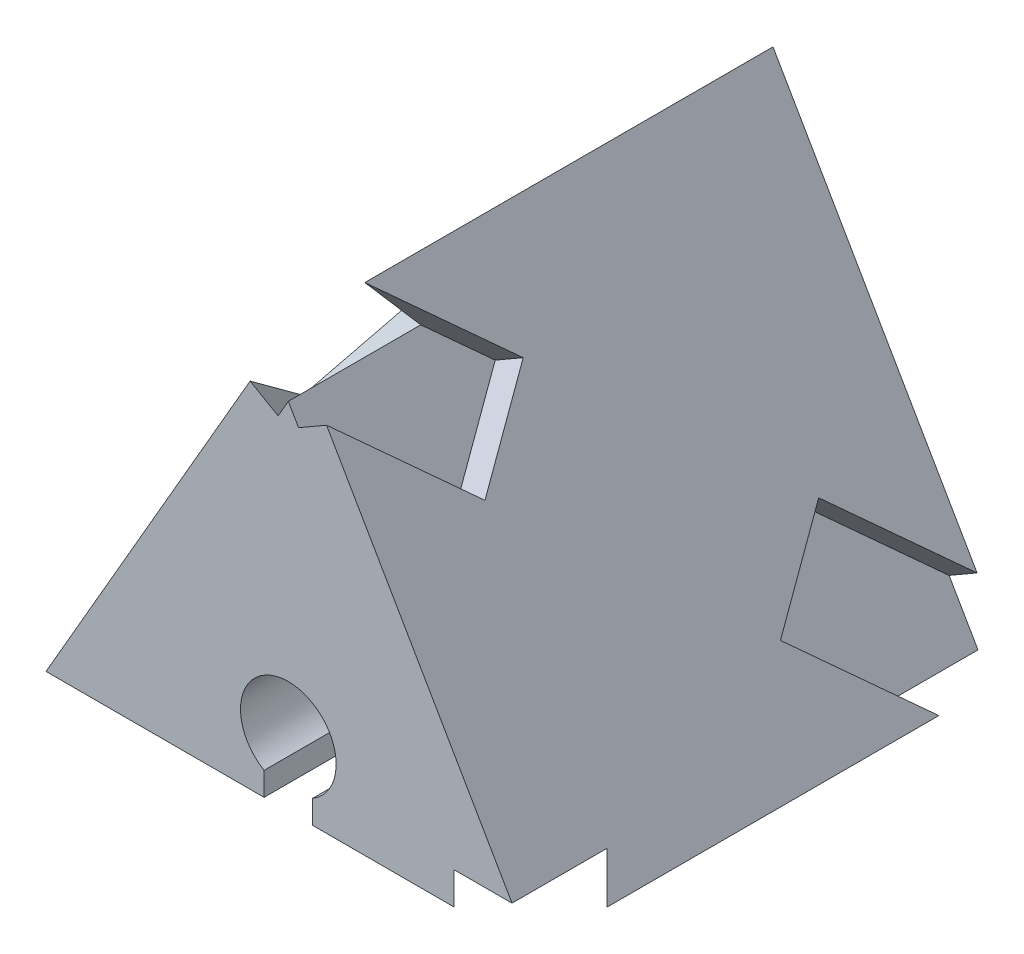
ISO-10303-21;
HEADER;
FILE_DESCRIPTION(('STEP AP214'),'2;1');
FILE_NAME('part.step','',(''),(''),'','','');
FILE_SCHEMA(('AUTOMOTIVE_DESIGN { 1 0 10303 214 1 1 1 1 }'));
ENDSEC;
DATA;
#1=APPLICATION_CONTEXT('core data for automotive mechanical design processes');
#2=APPLICATION_PROTOCOL_DEFINITION('international standard','automotive_design',2000,#1);
#3=PRODUCT_CONTEXT('',#1,'mechanical');
#4=PRODUCT('Part','Part','',(#3));
#5=PRODUCT_RELATED_PRODUCT_CATEGORY('part','',(#4));
#6=PRODUCT_DEFINITION_FORMATION('','',#4);
#7=PRODUCT_DEFINITION_CONTEXT('part definition',#1,'design');
#8=PRODUCT_DEFINITION('design','',#6,#7);
#9=PRODUCT_DEFINITION_SHAPE('','',#8);
#10=(LENGTH_UNIT() NAMED_UNIT(*) SI_UNIT(.MILLI.,.METRE.));
#11=(NAMED_UNIT(*) PLANE_ANGLE_UNIT() SI_UNIT($,.RADIAN.));
#12=(NAMED_UNIT(*) SI_UNIT($,.STERADIAN.) SOLID_ANGLE_UNIT());
#13=UNCERTAINTY_MEASURE_WITH_UNIT(LENGTH_MEASURE(1.E-05),#10,'distance_accuracy_value','');
#14=(GEOMETRIC_REPRESENTATION_CONTEXT(3) GLOBAL_UNCERTAINTY_ASSIGNED_CONTEXT((#13)) GLOBAL_UNIT_ASSIGNED_CONTEXT((#10,
#11,#12)) REPRESENTATION_CONTEXT('',''));
#15=CARTESIAN_POINT('',(0.,0.,0.));
#16=DIRECTION('',(0.,0.,1.));
#17=DIRECTION('',(1.,0.,0.));
#18=AXIS2_PLACEMENT_3D('',#15,#16,#17);
#19=CARTESIAN_POINT('',(38.1,0.,-38.1));
#20=DIRECTION('',(0.,0.,1.));
#21=DIRECTION('',(1.,0.,0.));
#22=AXIS2_PLACEMENT_3D('',#19,#20,#21);
#23=PLANE('',#22);
#24=DIRECTION('',(0.,-1.,0.));
#25=VECTOR('',#24,1.);
#26=CARTESIAN_POINT('',(6.00958739621938,0.,-38.1));
#27=LINE('',#26,#25);
#28=CARTESIAN_POINT('',(6.00958739621938,2.54,-38.1));
#29=VERTEX_POINT('',#28);
#30=CARTESIAN_POINT('',(6.00958739621938,0.,-38.1));
#31=VERTEX_POINT('',#30);
#32=EDGE_CURVE('E259',#29,#31,#27,.T.);
#33=ORIENTED_EDGE('',*,*,#32,.F.);
#34=DIRECTION('',(1.,0.,0.));
#35=VECTOR('',#34,1.);
#36=CARTESIAN_POINT('',(38.1,2.54000000000002,-38.1));
#37=LINE('',#36,#35);
#38=CARTESIAN_POINT('',(4.39940905122495,2.54,-38.1));
#39=VERTEX_POINT('',#38);
#40=EDGE_CURVE('E245',#39,#29,#37,.T.);
#41=ORIENTED_EDGE('',*,*,#40,.F.);
#42=DIRECTION('',(-0.5,-0.866025403784439,0.));
#43=VECTOR('',#42,1.);
#44=CARTESIAN_POINT('',(11.7247045256125,15.2277839420936,-38.1));
#45=LINE('',#44,#43);
#46=CARTESIAN_POINT('',(5.20449822372217,3.93445535138876,-38.1));
#47=VERTEX_POINT('',#46);
#48=EDGE_CURVE('E438',#47,#39,#45,.T.);
#49=ORIENTED_EDGE('',*,*,#48,.F.);
#50=DIRECTION('',(-0.866025403784439,0.5,0.));
#51=VECTOR('',#50,1.);
#52=CARTESIAN_POINT('',(31.5797936981097,-11.2933285907048,-38.1));
#53=LINE('',#52,#51);
#54=CARTESIAN_POINT('',(3.00479369810969,5.20445535138876,-38.1));
#55=VERTEX_POINT('',#54);
#56=EDGE_CURVE('E355',#47,#55,#53,.T.);
#57=ORIENTED_EDGE('',*,*,#56,.T.);
#58=DIRECTION('',(-0.5,-0.866025403784439,0.));
#59=VECTOR('',#58,1.);
#60=CARTESIAN_POINT('',(0.,0.,-38.1));
#61=LINE('',#60,#59);
#62=CARTESIAN_POINT('',(19.05,32.9955678841871,-38.1));
#63=VERTEX_POINT('',#62);
#64=EDGE_CURVE('E416',#63,#55,#61,.T.);
#65=ORIENTED_EDGE('',*,*,#64,.F.);
#66=DIRECTION('',(-0.5,0.866025403784439,0.));
#67=VECTOR('',#66,1.);
#68=CARTESIAN_POINT('',(38.1,0.,-38.1));
#69=LINE('',#68,#67);
#70=CARTESIAN_POINT('',(35.0952063018903,5.20445535138877,-38.1));
#71=VERTEX_POINT('',#70);
#72=EDGE_CURVE('E413',#71,#63,#69,.T.);
#73=ORIENTED_EDGE('',*,*,#72,.F.);
#74=DIRECTION('',(0.866025403784439,0.5,0.));
#75=VECTOR('',#74,1.);
#76=CARTESIAN_POINT('',(35.0952063018903,5.20445535138876,-38.1));
#77=LINE('',#76,#75);
#78=CARTESIAN_POINT('',(32.8955017762778,3.93445535138877,-38.1));
#79=VERTEX_POINT('',#78);
#80=EDGE_CURVE('E446',#79,#71,#77,.T.);
#81=ORIENTED_EDGE('',*,*,#80,.F.);
#82=DIRECTION('',(-0.5,0.866025403784439,0.));
#83=VECTOR('',#82,1.);
#84=CARTESIAN_POINT('',(35.9002954743875,-1.26999999999999,-38.1));
#85=LINE('',#84,#83);
#86=CARTESIAN_POINT('',(35.1670606325167,0.,-38.1));
#87=VERTEX_POINT('',#86);
#88=EDGE_CURVE('E444',#87,#79,#85,.T.);
#89=ORIENTED_EDGE('',*,*,#88,.F.);
#90=DIRECTION('',(1.,0.,0.));
#91=VECTOR('',#90,1.);
#92=CARTESIAN_POINT('',(0.,0.,-38.1));
#93=LINE('',#92,#91);
#94=CARTESIAN_POINT('',(20.955,0.,-38.1));
#95=VERTEX_POINT('',#94);
#96=EDGE_CURVE('E414',#95,#87,#93,.T.);
#97=ORIENTED_EDGE('',*,*,#96,.F.);
#98=DIRECTION('',(0.,1.,0.));
#99=VECTOR('',#98,1.);
#100=CARTESIAN_POINT('',(20.955,1.83923471383687,-38.1));
#101=LINE('',#100,#99);
#102=CARTESIAN_POINT('',(20.955,1.83923471383687,-38.1));
#103=VERTEX_POINT('',#102);
#104=EDGE_CURVE('E384',#95,#103,#101,.T.);
#105=ORIENTED_EDGE('',*,*,#104,.T.);
#106=CARTESIAN_POINT('',(19.05,5.08,-38.1));
#107=DIRECTION('',(0.,0.,1.));
#108=DIRECTION('',(1.,0.,0.));
#109=AXIS2_PLACEMENT_3D('',#106,#107,#108);
#110=CIRCLE('',#109,3.7592);
#111=CARTESIAN_POINT('',(17.145,1.83923471383687,-38.1));
#112=VERTEX_POINT('',#111);
#113=EDGE_CURVE('E396',#103,#112,#110,.T.);
#114=ORIENTED_EDGE('',*,*,#113,.T.);
#115=DIRECTION('',(0.,-1.,0.));
#116=VECTOR('',#115,1.);
#117=CARTESIAN_POINT('',(17.145,0.,-38.1));
#118=LINE('',#117,#116);
#119=CARTESIAN_POINT('',(17.145,0.,-38.1));
#120=VERTEX_POINT('',#119);
#121=EDGE_CURVE('E388',#112,#120,#118,.T.);
#122=ORIENTED_EDGE('',*,*,#121,.T.);
#123=EDGE_CURVE('E411',#31,#120,#93,.T.);
#124=ORIENTED_EDGE('',*,*,#123,.F.);
#125=EDGE_LOOP('',(#33,#41,#49,#57,#65,#73,#81,#89,#97,#105,#114,#122,#124));
#126=FACE_BOUND('',#125,.T.);
#127=ADVANCED_FACE('F34',(#126),#23,.F.);
#128=CARTESIAN_POINT('',(0.,0.,-38.1));
#129=DIRECTION('',(0.,-1.,0.));
#130=DIRECTION('',(1.,0.,0.));
#131=AXIS2_PLACEMENT_3D('',#128,#129,#130);
#132=PLANE('',#131);
#133=DIRECTION('',(0.,0.,1.));
#134=VECTOR('',#133,1.);
#135=CARTESIAN_POINT('',(0.,0.,-38.1));
#136=LINE('',#135,#134);
#137=CARTESIAN_POINT('',(0.,0.,-32.0904126037805));
#138=VERTEX_POINT('',#137);
#139=CARTESIAN_POINT('',(0.,0.,0.));
#140=VERTEX_POINT('',#139);
#141=EDGE_CURVE('E428',#138,#140,#136,.T.);
#142=ORIENTED_EDGE('',*,*,#141,.F.);
#143=DIRECTION('',(0.707106781186551,0.,0.707106781186544));
#144=VECTOR('',#143,1.);
#145=CARTESIAN_POINT('',(-8.783482259868,0.,-40.8738948636484));
#146=LINE('',#145,#144);
#147=CARTESIAN_POINT('',(8.30238704789757,0.,-23.788025555883));
#148=VERTEX_POINT('',#147);
#149=EDGE_CURVE('E250',#138,#148,#146,.T.);
#150=ORIENTED_EDGE('',*,*,#149,.T.);
#151=DIRECTION('',(0.707106781186548,0.,-0.707106781186547));
#152=VECTOR('',#151,1.);
#153=CARTESIAN_POINT('',(8.30238704789757,0.,-23.788025555883));
#154=LINE('',#153,#152);
#155=CARTESIAN_POINT('',(14.311974444117,0.,-29.7976129521025));
#156=VERTEX_POINT('',#155);
#157=EDGE_CURVE('E247',#148,#156,#154,.T.);
#158=ORIENTED_EDGE('',*,*,#157,.T.);
#159=DIRECTION('',(-0.707106781186551,0.,-0.707106781186544));
#160=VECTOR('',#159,1.);
#161=CARTESIAN_POINT('',(14.311974444117,0.,-29.7976129521025));
#162=LINE('',#161,#160);
#163=EDGE_CURVE('E240',#156,#31,#162,.T.);
#164=ORIENTED_EDGE('',*,*,#163,.T.);
#165=ORIENTED_EDGE('',*,*,#123,.T.);
#166=DIRECTION('',(0.,0.,-1.));
#167=VECTOR('',#166,1.);
#168=CARTESIAN_POINT('',(17.145,0.,0.));
#169=LINE('',#168,#167);
#170=CARTESIAN_POINT('',(17.145,0.,0.));
#171=VERTEX_POINT('',#170);
#172=EDGE_CURVE('E393',#171,#120,#169,.T.);
#173=ORIENTED_EDGE('',*,*,#172,.F.);
#174=DIRECTION('',(1.,0.,0.));
#175=VECTOR('',#174,1.);
#176=CARTESIAN_POINT('',(0.,0.,0.));
#177=LINE('',#176,#175);
#178=EDGE_CURVE('E420',#140,#171,#177,.T.);
#179=ORIENTED_EDGE('',*,*,#178,.F.);
#180=EDGE_LOOP('',(#142,#150,#158,#164,#165,#173,#179));
#181=FACE_BOUND('',#180,.T.);
#182=ADVANCED_FACE('F484',(#181),#132,.T.);
#183=CARTESIAN_POINT('',(-2.19203660432153,-8.87671877073564,-40.8738948636484));
#184=DIRECTION('',(-0.353553390593272,-0.612372435695791,0.707106781186551));
#185=DIRECTION('',(0.,-0.755928946018458,-0.654653670707973));
#186=AXIS2_PLACEMENT_3D('',#183,#184,#185);
#187=PLANE('',#186);
#188=DIRECTION('',(0.65465367070798,0.377964473009229,0.654653670707973));
#189=VECTOR('',#188,1.);
#190=CARTESIAN_POINT('',(-6.900212072569,-3.98383929756321,-38.9906246763494));
#191=LINE('',#190,#189);
#192=CARTESIAN_POINT('',(4.39940905122495,2.54,-27.6910035525556));
#193=VERTEX_POINT('',#192);
#194=EDGE_CURVE('E257',#138,#193,#191,.T.);
#195=ORIENTED_EDGE('',*,*,#194,.F.);
#196=DIRECTION('',(0.353553390593276,0.612372435695798,0.707106781186544));
#197=VECTOR('',#196,1.);
#198=CARTESIAN_POINT('',(-1.50239684905489,-2.60222767569447,-35.0952063018902));
#199=LINE('',#198,#197);
#200=CARTESIAN_POINT('',(4.15119352394878,7.19007809553018,-23.788025555883));
#201=VERTEX_POINT('',#200);
#202=EDGE_CURVE('E430',#138,#201,#199,.T.);
#203=ORIENTED_EDGE('',*,*,#202,.T.);
#204=DIRECTION('',(-0.866025403784439,0.5,0.));
#205=VECTOR('',#204,1.);
#206=CARTESIAN_POINT('',(6.35089804956126,5.92007809553018,-23.788025555883));
#207=LINE('',#206,#205);
#208=CARTESIAN_POINT('',(6.35089804956126,5.92007809553018,-23.788025555883));
#209=VERTEX_POINT('',#208);
#210=EDGE_CURVE('E349',#209,#201,#207,.T.);
#211=ORIENTED_EDGE('',*,*,#210,.F.);
#212=DIRECTION('',(0.353553390593276,0.612372435695797,0.707106781186544));
#213=VECTOR('',#212,1.);
#214=CARTESIAN_POINT('',(-2.19203660432153,-8.87671877073564,-40.8738948636484));
#215=LINE('',#214,#213);
#216=EDGE_CURVE('E340',#193,#209,#215,.T.);
#217=ORIENTED_EDGE('',*,*,#216,.F.);
#218=EDGE_LOOP('',(#195,#203,#211,#217));
#219=FACE_BOUND('',#218,.T.);
#220=ADVANCED_FACE('F490',(#219),#187,.F.);
#221=CARTESIAN_POINT('',(6.35089804956126,5.92007809553018,-23.788025555883));
#222=DIRECTION('',(-0.866025403784439,0.5,0.));
#223=DIRECTION('',(-0.5,-0.866025403784439,0.));
#224=AXIS2_PLACEMENT_3D('',#221,#222,#223);
#225=PLANE('',#224);
#226=ORIENTED_EDGE('',*,*,#48,.T.);
#227=DIRECTION('',(0.,0.,1.));
#228=VECTOR('',#227,1.);
#229=CARTESIAN_POINT('',(4.39940905122495,2.54,-23.788025555883));
#230=LINE('',#229,#228);
#231=EDGE_CURVE('E11',#39,#193,#230,.T.);
#232=ORIENTED_EDGE('',*,*,#231,.T.);
#233=ORIENTED_EDGE('',*,*,#216,.T.);
#234=DIRECTION('',(0.353553390593274,0.612372435695795,-0.707106781186547));
#235=VECTOR('',#234,1.);
#236=CARTESIAN_POINT('',(6.35089804956126,5.92007809553018,-23.788025555883));
#237=LINE('',#236,#235);
#238=CARTESIAN_POINT('',(9.355691747671,11.124533446919,-29.7976129521025));
#239=VERTEX_POINT('',#238);
#240=EDGE_CURVE('E342',#209,#239,#237,.T.);
#241=ORIENTED_EDGE('',*,*,#240,.T.);
#242=DIRECTION('',(-0.353553390593276,-0.612372435695798,-0.707106781186544));
#243=VECTOR('',#242,1.);
#244=CARTESIAN_POINT('',(9.355691747671,11.124533446919,-29.7976129521025));
#245=LINE('',#244,#243);
#246=EDGE_CURVE('E346',#239,#47,#245,.T.);
#247=ORIENTED_EDGE('',*,*,#246,.T.);
#248=EDGE_LOOP('',(#226,#232,#233,#241,#247));
#249=FACE_BOUND('',#248,.T.);
#250=ADVANCED_FACE('F504',(#249),#225,.T.);
#251=CARTESIAN_POINT('',(38.1,0.,-38.1));
#252=DIRECTION('',(0.866025403784439,0.5,0.));
#253=DIRECTION('',(-0.5,0.866025403784439,0.));
#254=AXIS2_PLACEMENT_3D('',#251,#252,#253);
#255=PLANE('',#254);
#256=DIRECTION('',(0.,0.,1.));
#257=VECTOR('',#256,1.);
#258=CARTESIAN_POINT('',(36.6335303162583,2.54000000000002,-38.1));
#259=LINE('',#258,#257);
#260=CARTESIAN_POINT('',(36.6335303162584,2.54000000000002,-7.47605707996119));
#261=VERTEX_POINT('',#260);
#262=CARTESIAN_POINT('',(36.6335303162583,2.54000000000002,0.));
#263=VERTEX_POINT('',#262);
#264=EDGE_CURVE('E57',#261,#263,#259,.T.);
#265=ORIENTED_EDGE('',*,*,#264,.F.);
#266=DIRECTION('',(0.447213595499958,-0.774596669241484,0.447213595499957));
#267=VECTOR('',#266,1.);
#268=CARTESIAN_POINT('',(31.6819174792439,11.1164450131193,-12.4276699169756));
#269=LINE('',#268,#267);
#270=CARTESIAN_POINT('',(38.1,0.,-6.00958739621953));
#271=VERTEX_POINT('',#270);
#272=EDGE_CURVE('E283',#261,#271,#269,.T.);
#273=ORIENTED_EDGE('',*,*,#272,.T.);
#274=DIRECTION('',(0.,0.,1.));
#275=VECTOR('',#274,1.);
#276=CARTESIAN_POINT('',(38.1,0.,-38.1));
#277=LINE('',#276,#275);
#278=CARTESIAN_POINT('',(38.1,0.,-32.0904126037805));
#279=VERTEX_POINT('',#278);
#280=EDGE_CURVE('E419',#279,#271,#277,.T.);
#281=ORIENTED_EDGE('',*,*,#280,.F.);
#282=DIRECTION('',(-0.353553390593276,0.612372435695797,0.707106781186544));
#283=VECTOR('',#282,1.);
#284=CARTESIAN_POINT('',(42.491741129934,-7.60671877073564,-40.8738948636484));
#285=LINE('',#284,#283);
#286=CARTESIAN_POINT('',(33.9488064760512,7.19007809553019,-23.788025555883));
#287=VERTEX_POINT('',#286);
#288=EDGE_CURVE('E286',#279,#287,#285,.T.);
#289=ORIENTED_EDGE('',*,*,#288,.T.);
#290=DIRECTION('',(-0.353553390593274,0.612372435695795,-0.707106781186547));
#291=VECTOR('',#290,1.);
#292=CARTESIAN_POINT('',(33.9488064760512,7.19007809553019,-23.788025555883));
#293=LINE('',#292,#291);
#294=CARTESIAN_POINT('',(30.9440127779415,12.394533446919,-29.7976129521025));
#295=VERTEX_POINT('',#294);
#296=EDGE_CURVE('E290',#287,#295,#293,.T.);
#297=ORIENTED_EDGE('',*,*,#296,.T.);
#298=DIRECTION('',(0.353553390593276,-0.612372435695798,-0.707106781186544));
#299=VECTOR('',#298,1.);
#300=CARTESIAN_POINT('',(30.9440127779415,12.394533446919,-29.7976129521025));
#301=LINE('',#300,#299);
#302=EDGE_CURVE('E298',#295,#71,#301,.T.);
#303=ORIENTED_EDGE('',*,*,#302,.T.);
#304=ORIENTED_EDGE('',*,*,#72,.T.);
#305=DIRECTION('',(0.,0.,1.));
#306=VECTOR('',#305,1.);
#307=CARTESIAN_POINT('',(19.05,32.9955678841871,-38.1));
#308=LINE('',#307,#306);
#309=CARTESIAN_POINT('',(19.05,32.9955678841871,-6.00958739621954));
#310=VERTEX_POINT('',#309);
#311=EDGE_CURVE('E431',#63,#310,#308,.T.);
#312=ORIENTED_EDGE('',*,*,#311,.T.);
#313=DIRECTION('',(0.353553390593274,-0.612372435695795,-0.707106781186547));
#314=VECTOR('',#313,1.);
#315=CARTESIAN_POINT('',(23.2011935239488,25.8054897886569,-14.3119744441171));
#316=LINE('',#315,#314);
#317=CARTESIAN_POINT('',(23.2011935239488,25.8054897886569,-14.3119744441171));
#318=VERTEX_POINT('',#317);
#319=EDGE_CURVE('E310',#310,#318,#316,.T.);
#320=ORIENTED_EDGE('',*,*,#319,.T.);
#321=DIRECTION('',(0.353553390593273,-0.612372435695793,0.707106781186549));
#322=VECTOR('',#321,1.);
#323=CARTESIAN_POINT('',(26.2059872220585,20.6010344372681,-8.3023870478976));
#324=LINE('',#323,#322);
#325=CARTESIAN_POINT('',(26.2059872220585,20.6010344372681,-8.3023870478976));
#326=VERTEX_POINT('',#325);
#327=EDGE_CURVE('E314',#318,#326,#324,.T.);
#328=ORIENTED_EDGE('',*,*,#327,.T.);
#329=DIRECTION('',(-0.353553390593275,0.612372435695797,0.707106781186544));
#330=VECTOR('',#329,1.);
#331=CARTESIAN_POINT('',(17.6630525681757,35.397831303534,8.78348225986793));
#332=LINE('',#331,#330);
#333=CARTESIAN_POINT('',(22.0547936981097,27.7911125327984,0.));
#334=VERTEX_POINT('',#333);
#335=EDGE_CURVE('E322',#326,#334,#332,.T.);
#336=ORIENTED_EDGE('',*,*,#335,.T.);
#337=DIRECTION('',(-0.5,0.866025403784439,0.));
#338=VECTOR('',#337,1.);
#339=CARTESIAN_POINT('',(38.1,0.,0.));
#340=LINE('',#339,#338);
#341=EDGE_CURVE('E423',#263,#334,#340,.T.);
#342=ORIENTED_EDGE('',*,*,#341,.F.);
#343=EDGE_LOOP('',(#265,#273,#281,#289,#297,#303,#304,#312,#320,#328,#336,#342));
#344=FACE_BOUND('',#343,.T.);
#345=ADVANCED_FACE('F502',(#344),#255,.T.);
#346=ORIENTED_EDGE('',*,*,#280,.T.);
#347=DIRECTION('',(-0.707106781186548,0.,-0.707106781186547));
#348=VECTOR('',#347,1.);
#349=CARTESIAN_POINT('',(29.7976129521024,0.,-14.3119744441171));
#350=LINE('',#349,#348);
#351=CARTESIAN_POINT('',(29.7976129521024,0.,-14.3119744441171));
#352=VERTEX_POINT('',#351);
#353=EDGE_CURVE('E261',#271,#352,#350,.T.);
#354=ORIENTED_EDGE('',*,*,#353,.T.);
#355=DIRECTION('',(-0.707106781186546,0.,0.707106781186549));
#356=VECTOR('',#355,1.);
#357=CARTESIAN_POINT('',(23.788025555883,0.,-8.3023870478976));
#358=LINE('',#357,#356);
#359=CARTESIAN_POINT('',(23.788025555883,0.,-8.3023870478976));
#360=VERTEX_POINT('',#359);
#361=EDGE_CURVE('E265',#352,#360,#358,.T.);
#362=ORIENTED_EDGE('',*,*,#361,.T.);
#363=DIRECTION('',(0.707106781186551,0.,0.707106781186544));
#364=VECTOR('',#363,1.);
#365=CARTESIAN_POINT('',(40.8738948636487,0.,8.78348225986793));
#366=LINE('',#365,#364);
#367=CARTESIAN_POINT('',(32.0904126037806,0.,0.));
#368=VERTEX_POINT('',#367);
#369=EDGE_CURVE('E273',#360,#368,#366,.T.);
#370=ORIENTED_EDGE('',*,*,#369,.T.);
#371=CARTESIAN_POINT('',(20.955,0.,0.));
#372=VERTEX_POINT('',#371);
#373=EDGE_CURVE('E410',#372,#368,#177,.T.);
#374=ORIENTED_EDGE('',*,*,#373,.F.);
#375=DIRECTION('',(0.,0.,-1.));
#376=VECTOR('',#375,1.);
#377=CARTESIAN_POINT('',(20.955,0.,0.));
#378=LINE('',#377,#376);
#379=EDGE_CURVE('E407',#372,#95,#378,.T.);
#380=ORIENTED_EDGE('',*,*,#379,.T.);
#381=ORIENTED_EDGE('',*,*,#96,.T.);
#382=DIRECTION('',(0.,0.,1.));
#383=VECTOR('',#382,1.);
#384=CARTESIAN_POINT('',(35.1670606325167,0.,-38.1));
#385=LINE('',#384,#383);
#386=CARTESIAN_POINT('',(35.1670606325167,0.,-30.6239429200388));
#387=VERTEX_POINT('',#386);
#388=EDGE_CURVE('E306',#87,#387,#385,.T.);
#389=ORIENTED_EDGE('',*,*,#388,.T.);
#390=DIRECTION('',(0.894427190999918,0.,-0.447213595499954));
#391=VECTOR('',#390,1.);
#392=CARTESIAN_POINT('',(10.0238349584877,0.,-18.0523300830245));
#393=LINE('',#392,#391);
#394=EDGE_CURVE('E448',#387,#279,#393,.T.);
#395=ORIENTED_EDGE('',*,*,#394,.T.);
#396=EDGE_LOOP('',(#346,#354,#362,#370,#374,#380,#381,#389,#395));
#397=FACE_BOUND('',#396,.T.);
#398=ADVANCED_FACE('F36',(#397),#132,.T.);
#399=CARTESIAN_POINT('',(38.1,0.,0.));
#400=DIRECTION('',(0.,0.,1.));
#401=DIRECTION('',(1.,0.,0.));
#402=AXIS2_PLACEMENT_3D('',#399,#400,#401);
#403=PLANE('',#402);
#404=ORIENTED_EDGE('',*,*,#373,.T.);
#405=DIRECTION('',(0.,1.,0.));
#406=VECTOR('',#405,1.);
#407=CARTESIAN_POINT('',(32.0904126037806,0.,0.));
#408=LINE('',#407,#406);
#409=CARTESIAN_POINT('',(32.0904126037806,2.54000000000001,0.));
#410=VERTEX_POINT('',#409);
#411=EDGE_CURVE('E42',#368,#410,#408,.T.);
#412=ORIENTED_EDGE('',*,*,#411,.T.);
#413=DIRECTION('',(-1.,0.,0.));
#414=VECTOR('',#413,1.);
#415=CARTESIAN_POINT('',(38.1,2.54000000000002,0.));
#416=LINE('',#415,#414);
#417=EDGE_CURVE('E451',#263,#410,#416,.T.);
#418=ORIENTED_EDGE('',*,*,#417,.F.);
#419=ORIENTED_EDGE('',*,*,#341,.T.);
#420=DIRECTION('',(-0.866025403784439,-0.5,0.));
#421=VECTOR('',#420,1.);
#422=CARTESIAN_POINT('',(22.0547936981097,27.7911125327984,0.));
#423=LINE('',#422,#421);
#424=CARTESIAN_POINT('',(19.8550891724972,26.5211125327984,0.));
#425=VERTEX_POINT('',#424);
#426=EDGE_CURVE('E336',#334,#425,#423,.T.);
#427=ORIENTED_EDGE('',*,*,#426,.T.);
#428=DIRECTION('',(0.5,-0.866025403784439,0.));
#429=VECTOR('',#428,1.);
#430=CARTESIAN_POINT('',(35.9002954743875,-1.26999999999999,0.));
#431=LINE('',#430,#429);
#432=CARTESIAN_POINT('',(19.05,27.9155678841871,0.));
#433=VERTEX_POINT('',#432);
#434=EDGE_CURVE('E330',#433,#425,#431,.T.);
#435=ORIENTED_EDGE('',*,*,#434,.F.);
#436=DIRECTION('',(0.5,0.866025403784439,0.));
#437=VECTOR('',#436,1.);
#438=CARTESIAN_POINT('',(11.7247045256125,15.2277839420936,0.));
#439=LINE('',#438,#437);
#440=CARTESIAN_POINT('',(18.2449108275028,26.5211125327984,0.));
#441=VERTEX_POINT('',#440);
#442=EDGE_CURVE('E377',#441,#433,#439,.T.);
#443=ORIENTED_EDGE('',*,*,#442,.F.);
#444=DIRECTION('',(0.866025403784439,-0.5,0.));
#445=VECTOR('',#444,1.);
#446=CARTESIAN_POINT('',(44.6202063018903,11.2933285907048,0.));
#447=LINE('',#446,#445);
#448=CARTESIAN_POINT('',(16.0452063018903,27.7911125327984,0.));
#449=VERTEX_POINT('',#448);
#450=EDGE_CURVE('E382',#449,#441,#447,.T.);
#451=ORIENTED_EDGE('',*,*,#450,.F.);
#452=DIRECTION('',(-0.5,-0.866025403784439,0.));
#453=VECTOR('',#452,1.);
#454=CARTESIAN_POINT('',(0.,0.,0.));
#455=LINE('',#454,#453);
#456=EDGE_CURVE('E425',#449,#140,#455,.T.);
#457=ORIENTED_EDGE('',*,*,#456,.T.);
#458=ORIENTED_EDGE('',*,*,#178,.T.);
#459=DIRECTION('',(0.,-1.,0.));
#460=VECTOR('',#459,1.);
#461=CARTESIAN_POINT('',(17.145,0.,0.));
#462=LINE('',#461,#460);
#463=CARTESIAN_POINT('',(17.145,1.83923471383687,0.));
#464=VERTEX_POINT('',#463);
#465=EDGE_CURVE('E391',#464,#171,#462,.T.);
#466=ORIENTED_EDGE('',*,*,#465,.F.);
#467=CARTESIAN_POINT('',(19.05,5.08,0.));
#468=DIRECTION('',(0.,0.,1.));
#469=DIRECTION('',(1.,0.,0.));
#470=AXIS2_PLACEMENT_3D('',#467,#468,#469);
#471=CIRCLE('',#470,3.7592);
#472=CARTESIAN_POINT('',(20.955,1.83923471383687,0.));
#473=VERTEX_POINT('',#472);
#474=EDGE_CURVE('E387',#473,#464,#471,.T.);
#475=ORIENTED_EDGE('',*,*,#474,.F.);
#476=DIRECTION('',(0.,1.,0.));
#477=VECTOR('',#476,1.);
#478=CARTESIAN_POINT('',(20.955,1.83923471383687,0.));
#479=LINE('',#478,#477);
#480=EDGE_CURVE('E385',#372,#473,#479,.T.);
#481=ORIENTED_EDGE('',*,*,#480,.F.);
#482=EDGE_LOOP('',(#404,#412,#418,#419,#427,#435,#443,#451,#457,#458,#466,#475,#481));
#483=FACE_BOUND('',#482,.T.);
#484=ADVANCED_FACE('F455',(#483),#403,.T.);
#485=CARTESIAN_POINT('',(17.0985110016637,24.5354897886569,-14.3119744441171));
#486=DIRECTION('',(0.353553390593274,0.612372435695794,-0.707106781186548));
#487=DIRECTION('',(0.,0.755928946018455,0.654653670707977));
#488=AXIS2_PLACEMENT_3D('',#485,#486,#487);
#489=PLANE('',#488);
#490=DIRECTION('',(0.,-0.755928946018455,-0.654653670707977));
#491=VECTOR('',#490,1.);
#492=CARTESIAN_POINT('',(19.05,24.0526214892955,-13.7544061588781));
#493=LINE('',#492,#491);
#494=CARTESIAN_POINT('',(19.05,27.9155678841871,-10.4089964474445));
#495=VERTEX_POINT('',#494);
#496=EDGE_CURVE('E333',#310,#495,#493,.T.);
#497=ORIENTED_EDGE('',*,*,#496,.F.);
#498=DIRECTION('',(-0.353553390593274,-0.612372435695795,-0.707106781186547));
#499=VECTOR('',#498,1.);
#500=CARTESIAN_POINT('',(14.8988064760512,25.8054897886569,-14.3119744441171));
#501=LINE('',#500,#499);
#502=CARTESIAN_POINT('',(14.8988064760512,25.8054897886569,-14.3119744441171));
#503=VERTEX_POINT('',#502);
#504=EDGE_CURVE('E359',#310,#503,#501,.T.);
#505=ORIENTED_EDGE('',*,*,#504,.T.);
#506=DIRECTION('',(-0.866025403784439,0.5,0.));
#507=VECTOR('',#506,1.);
#508=CARTESIAN_POINT('',(17.0985110016637,24.5354897886569,-14.3119744441171));
#509=LINE('',#508,#507);
#510=CARTESIAN_POINT('',(17.0985110016637,24.5354897886569,-14.3119744441171));
#511=VERTEX_POINT('',#510);
#512=EDGE_CURVE('E369',#511,#503,#509,.T.);
#513=ORIENTED_EDGE('',*,*,#512,.F.);
#514=DIRECTION('',(-0.353553390593274,-0.612372435695795,-0.707106781186547));
#515=VECTOR('',#514,1.);
#516=CARTESIAN_POINT('',(17.0985110016637,24.5354897886569,-14.3119744441171));
#517=LINE('',#516,#515);
#518=EDGE_CURVE('E360',#495,#511,#517,.T.);
#519=ORIENTED_EDGE('',*,*,#518,.F.);
#520=EDGE_LOOP('',(#497,#505,#513,#519));
#521=FACE_BOUND('',#520,.T.);
#522=ADVANCED_FACE('F498',(#521),#489,.F.);
#523=CARTESIAN_POINT('',(0.,0.,-38.1));
#524=DIRECTION('',(-0.866025403784439,0.5,0.));
#525=DIRECTION('',(-0.5,-0.866025403784439,0.));
#526=AXIS2_PLACEMENT_3D('',#523,#524,#525);
#527=PLANE('',#526);
#528=ORIENTED_EDGE('',*,*,#202,.F.);
#529=ORIENTED_EDGE('',*,*,#141,.T.);
#530=ORIENTED_EDGE('',*,*,#456,.F.);
#531=DIRECTION('',(0.353553390593275,0.612372435695797,0.707106781186544));
#532=VECTOR('',#531,1.);
#533=CARTESIAN_POINT('',(20.4369474318243,35.397831303534,8.78348225986793));
#534=LINE('',#533,#532);
#535=CARTESIAN_POINT('',(11.8940127779415,20.6010344372681,-8.3023870478976));
#536=VERTEX_POINT('',#535);
#537=EDGE_CURVE('E363',#536,#449,#534,.T.);
#538=ORIENTED_EDGE('',*,*,#537,.F.);
#539=DIRECTION('',(-0.353553390593273,-0.612372435695793,0.707106781186549));
#540=VECTOR('',#539,1.);
#541=CARTESIAN_POINT('',(11.8940127779415,20.6010344372681,-8.3023870478976));
#542=LINE('',#541,#540);
#543=EDGE_CURVE('E371',#503,#536,#542,.T.);
#544=ORIENTED_EDGE('',*,*,#543,.F.);
#545=ORIENTED_EDGE('',*,*,#504,.F.);
#546=ORIENTED_EDGE('',*,*,#311,.F.);
#547=ORIENTED_EDGE('',*,*,#64,.T.);
#548=DIRECTION('',(-0.353553390593276,-0.612372435695798,-0.707106781186544));
#549=VECTOR('',#548,1.);
#550=CARTESIAN_POINT('',(7.15598722205853,12.394533446919,-29.7976129521025));
#551=LINE('',#550,#549);
#552=CARTESIAN_POINT('',(7.15598722205853,12.394533446919,-29.7976129521025));
#553=VERTEX_POINT('',#552);
#554=EDGE_CURVE('E343',#553,#55,#551,.T.);
#555=ORIENTED_EDGE('',*,*,#554,.F.);
#556=DIRECTION('',(0.353553390593274,0.612372435695795,-0.707106781186547));
#557=VECTOR('',#556,1.);
#558=CARTESIAN_POINT('',(4.15119352394879,7.19007809553019,-23.788025555883));
#559=LINE('',#558,#557);
#560=EDGE_CURVE('E339',#201,#553,#559,.T.);
#561=ORIENTED_EDGE('',*,*,#560,.F.);
#562=EDGE_LOOP('',(#528,#529,#530,#538,#544,#545,#546,#547,#555,#561));
#563=FACE_BOUND('',#562,.T.);
#564=ADVANCED_FACE('F499',(#563),#527,.T.);
#565=CARTESIAN_POINT('',(20.955,1.83923471383687,0.));
#566=DIRECTION('',(-1.,0.,0.));
#567=DIRECTION('',(0.,0.,1.));
#568=AXIS2_PLACEMENT_3D('',#565,#566,#567);
#569=PLANE('',#568);
#570=ORIENTED_EDGE('',*,*,#104,.F.);
#571=ORIENTED_EDGE('',*,*,#379,.F.);
#572=ORIENTED_EDGE('',*,*,#480,.T.);
#573=DIRECTION('',(0.,0.,-1.));
#574=VECTOR('',#573,1.);
#575=CARTESIAN_POINT('',(20.955,1.83923471383687,0.));
#576=LINE('',#575,#574);
#577=EDGE_CURVE('E405',#473,#103,#576,.T.);
#578=ORIENTED_EDGE('',*,*,#577,.T.);
#579=EDGE_LOOP('',(#570,#571,#572,#578));
#580=FACE_BOUND('',#579,.T.);
#581=ADVANCED_FACE('F494',(#580),#569,.T.);
#582=CARTESIAN_POINT('',(19.05,5.08,0.));
#583=DIRECTION('',(0.,0.,-1.));
#584=DIRECTION('',(-1.,0.,0.));
#585=AXIS2_PLACEMENT_3D('',#582,#583,#584);
#586=CYLINDRICAL_SURFACE('',#585,3.7592);
#587=ORIENTED_EDGE('',*,*,#113,.F.);
#588=ORIENTED_EDGE('',*,*,#577,.F.);
#589=ORIENTED_EDGE('',*,*,#474,.T.);
#590=DIRECTION('',(0.,0.,-1.));
#591=VECTOR('',#590,1.);
#592=CARTESIAN_POINT('',(17.145,1.83923471383687,0.));
#593=LINE('',#592,#591);
#594=EDGE_CURVE('E403',#464,#112,#593,.T.);
#595=ORIENTED_EDGE('',*,*,#594,.T.);
#596=EDGE_LOOP('',(#587,#588,#589,#595));
#597=FACE_BOUND('',#596,.T.);
#598=ADVANCED_FACE('F549',(#597),#586,.F.);
#599=CARTESIAN_POINT('',(17.145,0.,0.));
#600=DIRECTION('',(1.,0.,0.));
#601=DIRECTION('',(0.,0.,-1.));
#602=AXIS2_PLACEMENT_3D('',#599,#600,#601);
#603=PLANE('',#602);
#604=ORIENTED_EDGE('',*,*,#121,.F.);
#605=ORIENTED_EDGE('',*,*,#594,.F.);
#606=ORIENTED_EDGE('',*,*,#465,.T.);
#607=ORIENTED_EDGE('',*,*,#172,.T.);
#608=EDGE_LOOP('',(#604,#605,#606,#607));
#609=FACE_BOUND('',#608,.T.);
#610=ADVANCED_FACE('F545',(#609),#603,.T.);
#611=CARTESIAN_POINT('',(22.6366519574368,34.127831303534,8.78348225986793));
#612=DIRECTION('',(-0.353553390593272,-0.612372435695792,0.707106781186551));
#613=DIRECTION('',(0.,-0.755928946018458,-0.654653670707974));
#614=AXIS2_PLACEMENT_3D('',#611,#612,#613);
#615=PLANE('',#614);
#616=ORIENTED_EDGE('',*,*,#450,.T.);
#617=DIRECTION('',(0.353553390593275,0.612372435695797,0.707106781186544));
#618=VECTOR('',#617,1.);
#619=CARTESIAN_POINT('',(22.6366519574368,34.127831303534,8.78348225986793));
#620=LINE('',#619,#618);
#621=CARTESIAN_POINT('',(14.093717303554,19.3310344372681,-8.3023870478976));
#622=VERTEX_POINT('',#621);
#623=EDGE_CURVE('E366',#622,#441,#620,.T.);
#624=ORIENTED_EDGE('',*,*,#623,.F.);
#625=DIRECTION('',(-0.866025403784439,0.5,0.));
#626=VECTOR('',#625,1.);
#627=CARTESIAN_POINT('',(14.093717303554,19.3310344372681,-8.3023870478976));
#628=LINE('',#627,#626);
#629=EDGE_CURVE('E375',#622,#536,#628,.T.);
#630=ORIENTED_EDGE('',*,*,#629,.T.);
#631=ORIENTED_EDGE('',*,*,#537,.T.);
#632=EDGE_LOOP('',(#616,#624,#630,#631));
#633=FACE_BOUND('',#632,.T.);
#634=ADVANCED_FACE('F532',(#633),#615,.F.);
#635=CARTESIAN_POINT('',(14.093717303554,19.3310344372681,-8.3023870478976));
#636=DIRECTION('',(-0.353553390593275,-0.612372435695796,-0.707106781186546));
#637=DIRECTION('',(0.,0.755928946018453,-0.654653670707979));
#638=AXIS2_PLACEMENT_3D('',#635,#636,#637);
#639=PLANE('',#638);
#640=ORIENTED_EDGE('',*,*,#543,.T.);
#641=ORIENTED_EDGE('',*,*,#629,.F.);
#642=DIRECTION('',(-0.353553390593273,-0.612372435695793,0.707106781186549));
#643=VECTOR('',#642,1.);
#644=CARTESIAN_POINT('',(14.093717303554,19.3310344372681,-8.3023870478976));
#645=LINE('',#644,#643);
#646=EDGE_CURVE('E362',#511,#622,#645,.T.);
#647=ORIENTED_EDGE('',*,*,#646,.F.);
#648=ORIENTED_EDGE('',*,*,#512,.T.);
#649=EDGE_LOOP('',(#640,#641,#647,#648));
#650=FACE_BOUND('',#649,.T.);
#651=ADVANCED_FACE('F604',(#650),#639,.F.);
#652=CARTESIAN_POINT('',(25.6414456555465,39.3322866549228,2.7738948636485));
#653=DIRECTION('',(0.866025403784439,-0.5,0.));
#654=DIRECTION('',(0.5,0.866025403784439,0.));
#655=AXIS2_PLACEMENT_3D('',#652,#653,#654);
#656=PLANE('',#655);
#657=ORIENTED_EDGE('',*,*,#442,.T.);
#658=DIRECTION('',(0.,0.,-1.));
#659=VECTOR('',#658,1.);
#660=CARTESIAN_POINT('',(19.05,27.9155678841871,2.7738948636485));
#661=LINE('',#660,#659);
#662=EDGE_CURVE('E441',#433,#495,#661,.T.);
#663=ORIENTED_EDGE('',*,*,#662,.T.);
#664=ORIENTED_EDGE('',*,*,#518,.T.);
#665=ORIENTED_EDGE('',*,*,#646,.T.);
#666=ORIENTED_EDGE('',*,*,#623,.T.);
#667=EDGE_LOOP('',(#657,#663,#664,#665,#666));
#668=FACE_BOUND('',#667,.T.);
#669=ADVANCED_FACE('F527',(#668),#656,.F.);
#670=CARTESIAN_POINT('',(9.355691747671,11.124533446919,-29.7976129521025));
#671=DIRECTION('',(0.353553390593272,0.612372435695791,-0.707106781186551));
#672=DIRECTION('',(0.,0.755928946018458,0.654653670707974));
#673=AXIS2_PLACEMENT_3D('',#670,#671,#672);
#674=PLANE('',#673);
#675=ORIENTED_EDGE('',*,*,#246,.F.);
#676=DIRECTION('',(-0.866025403784439,0.5,0.));
#677=VECTOR('',#676,1.);
#678=CARTESIAN_POINT('',(9.355691747671,11.124533446919,-29.7976129521025));
#679=LINE('',#678,#677);
#680=EDGE_CURVE('E353',#239,#553,#679,.T.);
#681=ORIENTED_EDGE('',*,*,#680,.T.);
#682=ORIENTED_EDGE('',*,*,#554,.T.);
#683=ORIENTED_EDGE('',*,*,#56,.F.);
#684=EDGE_LOOP('',(#675,#681,#682,#683));
#685=FACE_BOUND('',#684,.T.);
#686=ADVANCED_FACE('F592',(#685),#674,.F.);
#687=CARTESIAN_POINT('',(6.35089804956126,5.92007809553018,-23.788025555883));
#688=DIRECTION('',(0.353553390593274,0.612372435695794,0.707106781186548));
#689=DIRECTION('',(0.,-0.755928946018455,0.654653670707977));
#690=AXIS2_PLACEMENT_3D('',#687,#688,#689);
#691=PLANE('',#690);
#692=ORIENTED_EDGE('',*,*,#560,.T.);
#693=ORIENTED_EDGE('',*,*,#680,.F.);
#694=ORIENTED_EDGE('',*,*,#240,.F.);
#695=ORIENTED_EDGE('',*,*,#210,.T.);
#696=EDGE_LOOP('',(#692,#693,#694,#695));
#697=FACE_BOUND('',#696,.T.);
#698=ADVANCED_FACE('F589',(#697),#691,.F.);
#699=CARTESIAN_POINT('',(21.0014889983363,24.5354897886569,-14.3119744441171));
#700=DIRECTION('',(0.353553390593274,-0.612372435695794,0.707106781186548));
#701=DIRECTION('',(0.,-0.755928946018455,-0.654653670707977));
#702=AXIS2_PLACEMENT_3D('',#699,#700,#701);
#703=PLANE('',#702);
#704=ORIENTED_EDGE('',*,*,#496,.T.);
#705=DIRECTION('',(0.353553390593274,-0.612372435695795,-0.707106781186547));
#706=VECTOR('',#705,1.);
#707=CARTESIAN_POINT('',(21.0014889983363,24.5354897886569,-14.3119744441171));
#708=LINE('',#707,#706);
#709=CARTESIAN_POINT('',(21.0014889983363,24.5354897886569,-14.3119744441171));
#710=VERTEX_POINT('',#709);
#711=EDGE_CURVE('E311',#495,#710,#708,.T.);
#712=ORIENTED_EDGE('',*,*,#711,.T.);
#713=DIRECTION('',(0.866025403784439,0.5,0.));
#714=VECTOR('',#713,1.);
#715=CARTESIAN_POINT('',(21.0014889983363,24.5354897886569,-14.3119744441171));
#716=LINE('',#715,#714);
#717=EDGE_CURVE('E327',#710,#318,#716,.T.);
#718=ORIENTED_EDGE('',*,*,#717,.T.);
#719=ORIENTED_EDGE('',*,*,#319,.F.);
#720=EDGE_LOOP('',(#704,#712,#718,#719));
#721=FACE_BOUND('',#720,.T.);
#722=ADVANCED_FACE('F584',(#721),#703,.T.);
#723=CARTESIAN_POINT('',(24.006282696446,19.3310344372681,-8.3023870478976));
#724=DIRECTION('',(-0.353553390593275,0.612372435695796,0.707106781186546));
#725=DIRECTION('',(0.,-0.755928946018453,0.654653670707979));
#726=AXIS2_PLACEMENT_3D('',#723,#724,#725);
#727=PLANE('',#726);
#728=ORIENTED_EDGE('',*,*,#327,.F.);
#729=ORIENTED_EDGE('',*,*,#717,.F.);
#730=DIRECTION('',(0.353553390593273,-0.612372435695793,0.707106781186549));
#731=VECTOR('',#730,1.);
#732=CARTESIAN_POINT('',(24.006282696446,19.3310344372681,-8.3023870478976));
#733=LINE('',#732,#731);
#734=CARTESIAN_POINT('',(24.006282696446,19.3310344372681,-8.3023870478976));
#735=VERTEX_POINT('',#734);
#736=EDGE_CURVE('E317',#710,#735,#733,.T.);
#737=ORIENTED_EDGE('',*,*,#736,.T.);
#738=DIRECTION('',(0.866025403784439,0.5,0.));
#739=VECTOR('',#738,1.);
#740=CARTESIAN_POINT('',(24.006282696446,19.3310344372681,-8.3023870478976));
#741=LINE('',#740,#739);
#742=EDGE_CURVE('E319',#735,#326,#741,.T.);
#743=ORIENTED_EDGE('',*,*,#742,.T.);
#744=EDGE_LOOP('',(#728,#729,#737,#743));
#745=FACE_BOUND('',#744,.T.);
#746=ADVANCED_FACE('F581',(#745),#727,.T.);
#747=CARTESIAN_POINT('',(15.4633480425632,34.127831303534,8.78348225986793));
#748=DIRECTION('',(-0.353553390593272,0.612372435695792,-0.707106781186551));
#749=DIRECTION('',(0.,0.755928946018458,0.654653670707974));
#750=AXIS2_PLACEMENT_3D('',#747,#748,#749);
#751=PLANE('',#750);
#752=ORIENTED_EDGE('',*,*,#335,.F.);
#753=ORIENTED_EDGE('',*,*,#742,.F.);
#754=DIRECTION('',(-0.353553390593275,0.612372435695797,0.707106781186544));
#755=VECTOR('',#754,1.);
#756=CARTESIAN_POINT('',(15.4633480425632,34.127831303534,8.78348225986793));
#757=LINE('',#756,#755);
#758=EDGE_CURVE('E313',#735,#425,#757,.T.);
#759=ORIENTED_EDGE('',*,*,#758,.T.);
#760=ORIENTED_EDGE('',*,*,#426,.F.);
#761=EDGE_LOOP('',(#752,#753,#759,#760));
#762=FACE_BOUND('',#761,.T.);
#763=ADVANCED_FACE('F517',(#762),#751,.T.);
#764=CARTESIAN_POINT('',(12.4585543444535,39.3322866549228,2.7738948636485));
#765=DIRECTION('',(-0.866025403784439,-0.5,0.));
#766=DIRECTION('',(-0.5,0.866025403784439,0.));
#767=AXIS2_PLACEMENT_3D('',#764,#765,#766);
#768=PLANE('',#767);
#769=ORIENTED_EDGE('',*,*,#434,.T.);
#770=ORIENTED_EDGE('',*,*,#758,.F.);
#771=ORIENTED_EDGE('',*,*,#736,.F.);
#772=ORIENTED_EDGE('',*,*,#711,.F.);
#773=ORIENTED_EDGE('',*,*,#662,.F.);
#774=EDGE_LOOP('',(#769,#770,#771,#772,#773));
#775=FACE_BOUND('',#774,.T.);
#776=ADVANCED_FACE('F522',(#775),#768,.F.);
#777=CARTESIAN_POINT('',(28.744308252329,11.124533446919,-29.7976129521025));
#778=DIRECTION('',(0.353553390593272,-0.612372435695791,0.707106781186551));
#779=DIRECTION('',(0.,-0.755928946018458,-0.654653670707974));
#780=AXIS2_PLACEMENT_3D('',#777,#778,#779);
#781=PLANE('',#780);
#782=ORIENTED_EDGE('',*,*,#80,.T.);
#783=ORIENTED_EDGE('',*,*,#302,.F.);
#784=DIRECTION('',(0.866025403784439,0.5,0.));
#785=VECTOR('',#784,1.);
#786=CARTESIAN_POINT('',(28.744308252329,11.124533446919,-29.7976129521025));
#787=LINE('',#786,#785);
#788=CARTESIAN_POINT('',(28.744308252329,11.124533446919,-29.7976129521025));
#789=VERTEX_POINT('',#788);
#790=EDGE_CURVE('E295',#789,#295,#787,.T.);
#791=ORIENTED_EDGE('',*,*,#790,.F.);
#792=DIRECTION('',(0.353553390593276,-0.612372435695798,-0.707106781186544));
#793=VECTOR('',#792,1.);
#794=CARTESIAN_POINT('',(28.744308252329,11.124533446919,-29.7976129521025));
#795=LINE('',#794,#793);
#796=EDGE_CURVE('E289',#789,#79,#795,.T.);
#797=ORIENTED_EDGE('',*,*,#796,.T.);
#798=EDGE_LOOP('',(#782,#783,#791,#797));
#799=FACE_BOUND('',#798,.T.);
#800=ADVANCED_FACE('F563',(#799),#781,.T.);
#801=CARTESIAN_POINT('',(40.2920366043215,-8.87671877073564,-40.8738948636484));
#802=DIRECTION('',(-0.353553390593272,0.612372435695791,-0.707106781186551));
#803=DIRECTION('',(0.,0.755928946018458,0.654653670707973));
#804=AXIS2_PLACEMENT_3D('',#801,#802,#803);
#805=PLANE('',#804);
#806=DIRECTION('',(-0.353553390593276,0.612372435695797,0.707106781186544));
#807=VECTOR('',#806,1.);
#808=CARTESIAN_POINT('',(40.2920366043215,-8.87671877073564,-40.8738948636484));
#809=LINE('',#808,#807);
#810=CARTESIAN_POINT('',(31.7491019504387,5.92007809553019,-23.788025555883));
#811=VERTEX_POINT('',#810);
#812=EDGE_CURVE('E287',#387,#811,#809,.T.);
#813=ORIENTED_EDGE('',*,*,#812,.T.);
#814=DIRECTION('',(0.866025403784439,0.5,0.));
#815=VECTOR('',#814,1.);
#816=CARTESIAN_POINT('',(31.7491019504387,5.92007809553019,-23.788025555883));
#817=LINE('',#816,#815);
#818=EDGE_CURVE('E303',#811,#287,#817,.T.);
#819=ORIENTED_EDGE('',*,*,#818,.T.);
#820=ORIENTED_EDGE('',*,*,#288,.F.);
#821=ORIENTED_EDGE('',*,*,#394,.F.);
#822=EDGE_LOOP('',(#813,#819,#820,#821));
#823=FACE_BOUND('',#822,.T.);
#824=ADVANCED_FACE('F569',(#823),#805,.T.);
#825=CARTESIAN_POINT('',(31.7491019504387,5.92007809553019,-23.788025555883));
#826=DIRECTION('',(0.353553390593274,-0.612372435695794,-0.707106781186548));
#827=DIRECTION('',(0.,0.755928946018455,-0.654653670707977));
#828=AXIS2_PLACEMENT_3D('',#825,#826,#827);
#829=PLANE('',#828);
#830=ORIENTED_EDGE('',*,*,#296,.F.);
#831=ORIENTED_EDGE('',*,*,#818,.F.);
#832=DIRECTION('',(-0.353553390593274,0.612372435695795,-0.707106781186547));
#833=VECTOR('',#832,1.);
#834=CARTESIAN_POINT('',(31.7491019504387,5.92007809553019,-23.788025555883));
#835=LINE('',#834,#833);
#836=EDGE_CURVE('E293',#811,#789,#835,.T.);
#837=ORIENTED_EDGE('',*,*,#836,.T.);
#838=ORIENTED_EDGE('',*,*,#790,.T.);
#839=EDGE_LOOP('',(#830,#831,#837,#838));
#840=FACE_BOUND('',#839,.T.);
#841=ADVANCED_FACE('F566',(#840),#829,.T.);
#842=CARTESIAN_POINT('',(31.7491019504387,5.92007809553019,-23.788025555883));
#843=DIRECTION('',(0.866025403784439,0.5,0.));
#844=DIRECTION('',(0.5,-0.866025403784439,0.));
#845=AXIS2_PLACEMENT_3D('',#842,#843,#844);
#846=PLANE('',#845);
#847=ORIENTED_EDGE('',*,*,#88,.T.);
#848=ORIENTED_EDGE('',*,*,#796,.F.);
#849=ORIENTED_EDGE('',*,*,#836,.F.);
#850=ORIENTED_EDGE('',*,*,#812,.F.);
#851=ORIENTED_EDGE('',*,*,#388,.F.);
#852=EDGE_LOOP('',(#847,#848,#849,#850,#851));
#853=FACE_BOUND('',#852,.T.);
#854=ADVANCED_FACE('F558',(#853),#846,.T.);
#855=CARTESIAN_POINT('',(29.7976129521024,2.54000000000001,-14.3119744441171));
#856=DIRECTION('',(-0.707106781186547,0.,0.707106781186548));
#857=DIRECTION('',(0.707106781186548,0.,0.707106781186547));
#858=AXIS2_PLACEMENT_3D('',#855,#856,#857);
#859=PLANE('',#858);
#860=DIRECTION('',(-0.707106781186548,0.,-0.707106781186547));
#861=VECTOR('',#860,1.);
#862=CARTESIAN_POINT('',(29.7976129521024,2.54000000000001,-14.3119744441171));
#863=LINE('',#862,#861);
#864=CARTESIAN_POINT('',(29.7976129521024,2.54000000000001,-14.3119744441171));
#865=VERTEX_POINT('',#864);
#866=EDGE_CURVE('E262',#261,#865,#863,.T.);
#867=ORIENTED_EDGE('',*,*,#866,.T.);
#868=DIRECTION('',(0.,-1.,0.));
#869=VECTOR('',#868,1.);
#870=CARTESIAN_POINT('',(29.7976129521024,2.54000000000001,-14.3119744441171));
#871=LINE('',#870,#869);
#872=EDGE_CURVE('E278',#865,#352,#871,.T.);
#873=ORIENTED_EDGE('',*,*,#872,.T.);
#874=ORIENTED_EDGE('',*,*,#353,.F.);
#875=ORIENTED_EDGE('',*,*,#272,.F.);
#876=EDGE_LOOP('',(#867,#873,#874,#875));
#877=FACE_BOUND('',#876,.T.);
#878=ADVANCED_FACE('F469',(#877),#859,.T.);
#879=CARTESIAN_POINT('',(23.788025555883,2.54000000000001,-8.3023870478976));
#880=DIRECTION('',(0.707106781186549,0.,0.707106781186546));
#881=DIRECTION('',(0.707106781186546,0.,-0.707106781186549));
#882=AXIS2_PLACEMENT_3D('',#879,#880,#881);
#883=PLANE('',#882);
#884=ORIENTED_EDGE('',*,*,#361,.F.);
#885=ORIENTED_EDGE('',*,*,#872,.F.);
#886=DIRECTION('',(-0.707106781186546,0.,0.707106781186549));
#887=VECTOR('',#886,1.);
#888=CARTESIAN_POINT('',(23.788025555883,2.54000000000001,-8.3023870478976));
#889=LINE('',#888,#887);
#890=CARTESIAN_POINT('',(23.788025555883,2.54000000000001,-8.3023870478976));
#891=VERTEX_POINT('',#890);
#892=EDGE_CURVE('E268',#865,#891,#889,.T.);
#893=ORIENTED_EDGE('',*,*,#892,.T.);
#894=DIRECTION('',(0.,-1.,0.));
#895=VECTOR('',#894,1.);
#896=CARTESIAN_POINT('',(23.788025555883,2.54000000000001,-8.3023870478976));
#897=LINE('',#896,#895);
#898=EDGE_CURVE('E270',#891,#360,#897,.T.);
#899=ORIENTED_EDGE('',*,*,#898,.T.);
#900=EDGE_LOOP('',(#884,#885,#893,#899));
#901=FACE_BOUND('',#900,.T.);
#902=ADVANCED_FACE('F467',(#901),#883,.T.);
#903=CARTESIAN_POINT('',(40.8738948636487,2.54000000000001,8.78348225986793));
#904=DIRECTION('',(0.707106781186544,0.,-0.707106781186551));
#905=DIRECTION('',(-0.707106781186551,0.,-0.707106781186544));
#906=AXIS2_PLACEMENT_3D('',#903,#904,#905);
#907=PLANE('',#906);
#908=ORIENTED_EDGE('',*,*,#369,.F.);
#909=ORIENTED_EDGE('',*,*,#898,.F.);
#910=DIRECTION('',(0.707106781186551,0.,0.707106781186544));
#911=VECTOR('',#910,1.);
#912=CARTESIAN_POINT('',(40.8738948636487,2.54000000000001,8.78348225986793));
#913=LINE('',#912,#911);
#914=EDGE_CURVE('E264',#891,#410,#913,.T.);
#915=ORIENTED_EDGE('',*,*,#914,.T.);
#916=ORIENTED_EDGE('',*,*,#411,.F.);
#917=EDGE_LOOP('',(#908,#909,#915,#916));
#918=FACE_BOUND('',#917,.T.);
#919=ADVANCED_FACE('F461',(#918),#907,.T.);
#920=CARTESIAN_POINT('',(46.8834822598681,2.54000000000002,2.7738948636485));
#921=DIRECTION('',(0.,1.,0.));
#922=DIRECTION('',(1.,0.,0.));
#923=AXIS2_PLACEMENT_3D('',#920,#921,#922);
#924=PLANE('',#923);
#925=ORIENTED_EDGE('',*,*,#264,.T.);
#926=ORIENTED_EDGE('',*,*,#417,.T.);
#927=ORIENTED_EDGE('',*,*,#914,.F.);
#928=ORIENTED_EDGE('',*,*,#892,.F.);
#929=ORIENTED_EDGE('',*,*,#866,.F.);
#930=EDGE_LOOP('',(#925,#926,#927,#928,#929));
#931=FACE_BOUND('',#930,.T.);
#932=ADVANCED_FACE('F471',(#931),#924,.F.);
#933=CARTESIAN_POINT('',(14.311974444117,2.54000000000001,-29.7976129521025));
#934=DIRECTION('',(-0.707106781186544,0.,0.707106781186551));
#935=DIRECTION('',(0.707106781186551,0.,0.707106781186544));
#936=AXIS2_PLACEMENT_3D('',#933,#934,#935);
#937=PLANE('',#936);
#938=ORIENTED_EDGE('',*,*,#32,.T.);
#939=ORIENTED_EDGE('',*,*,#163,.F.);
#940=DIRECTION('',(0.,-1.,0.));
#941=VECTOR('',#940,1.);
#942=CARTESIAN_POINT('',(14.311974444117,2.54000000000001,-29.7976129521025));
#943=LINE('',#942,#941);
#944=CARTESIAN_POINT('',(14.311974444117,2.54000000000001,-29.7976129521025));
#945=VERTEX_POINT('',#944);
#946=EDGE_CURVE('E228',#945,#156,#943,.T.);
#947=ORIENTED_EDGE('',*,*,#946,.F.);
#948=DIRECTION('',(-0.707106781186551,0.,-0.707106781186544));
#949=VECTOR('',#948,1.);
#950=CARTESIAN_POINT('',(14.311974444117,2.54000000000001,-29.7976129521025));
#951=LINE('',#950,#949);
#952=EDGE_CURVE('E233',#945,#29,#951,.T.);
#953=ORIENTED_EDGE('',*,*,#952,.T.);
#954=EDGE_LOOP('',(#938,#939,#947,#953));
#955=FACE_BOUND('',#954,.T.);
#956=ADVANCED_FACE('F237',(#955),#937,.T.);
#957=CARTESIAN_POINT('',(-8.78348225986801,2.54,-40.8738948636484));
#958=DIRECTION('',(0.707106781186544,0.,-0.707106781186551));
#959=DIRECTION('',(-0.707106781186551,0.,-0.707106781186544));
#960=AXIS2_PLACEMENT_3D('',#957,#958,#959);
#961=PLANE('',#960);
#962=ORIENTED_EDGE('',*,*,#194,.T.);
#963=DIRECTION('',(0.707106781186551,0.,0.707106781186544));
#964=VECTOR('',#963,1.);
#965=CARTESIAN_POINT('',(-8.78348225986801,2.54,-40.8738948636484));
#966=LINE('',#965,#964);
#967=CARTESIAN_POINT('',(8.30238704789757,2.54,-23.788025555883));
#968=VERTEX_POINT('',#967);
#969=EDGE_CURVE('E49',#193,#968,#966,.T.);
#970=ORIENTED_EDGE('',*,*,#969,.T.);
#971=DIRECTION('',(0.,-1.,0.));
#972=VECTOR('',#971,1.);
#973=CARTESIAN_POINT('',(8.30238704789757,2.54,-23.788025555883));
#974=LINE('',#973,#972);
#975=EDGE_CURVE('E231',#968,#148,#974,.T.);
#976=ORIENTED_EDGE('',*,*,#975,.T.);
#977=ORIENTED_EDGE('',*,*,#149,.F.);
#978=EDGE_LOOP('',(#962,#970,#976,#977));
#979=FACE_BOUND('',#978,.T.);
#980=ADVANCED_FACE('F478',(#979),#961,.T.);
#981=CARTESIAN_POINT('',(8.30238704789757,2.54,-23.788025555883));
#982=DIRECTION('',(0.,-1.,0.));
#983=DIRECTION('',(-1.,0.,0.));
#984=AXIS2_PLACEMENT_3D('',#981,#982,#983);
#985=PLANE('',#984);
#986=ORIENTED_EDGE('',*,*,#40,.T.);
#987=ORIENTED_EDGE('',*,*,#952,.F.);
#988=DIRECTION('',(0.707106781186548,0.,-0.707106781186547));
#989=VECTOR('',#988,1.);
#990=CARTESIAN_POINT('',(8.30238704789757,2.54,-23.788025555883));
#991=LINE('',#990,#989);
#992=EDGE_CURVE('E225',#968,#945,#991,.T.);
#993=ORIENTED_EDGE('',*,*,#992,.F.);
#994=ORIENTED_EDGE('',*,*,#969,.F.);
#995=ORIENTED_EDGE('',*,*,#231,.F.);
#996=EDGE_LOOP('',(#986,#987,#993,#994,#995));
#997=FACE_BOUND('',#996,.T.);
#998=ADVANCED_FACE('F243',(#997),#985,.T.);
#999=CARTESIAN_POINT('',(8.30238704789757,2.54,-23.788025555883));
#1000=DIRECTION('',(-0.707106781186547,0.,-0.707106781186548));
#1001=DIRECTION('',(-0.707106781186548,0.,0.707106781186547));
#1002=AXIS2_PLACEMENT_3D('',#999,#1000,#1001);
#1003=PLANE('',#1002);
#1004=ORIENTED_EDGE('',*,*,#157,.F.);
#1005=ORIENTED_EDGE('',*,*,#975,.F.);
#1006=ORIENTED_EDGE('',*,*,#992,.T.);
#1007=ORIENTED_EDGE('',*,*,#946,.T.);
#1008=EDGE_LOOP('',(#1004,#1005,#1006,#1007));
#1009=FACE_BOUND('',#1008,.T.);
#1010=ADVANCED_FACE('F227',(#1009),#1003,.T.);
#1011=CLOSED_SHELL('',(#127,#182,#220,#250,#345,#398,#484,#522,#564,#581,#598,#610,#634,#651,
#669,#686,#698,#722,#746,#763,#776,#800,#824,#841,#854,#878,#902,#919,#932,#956,#980,#998,#1010));
#1012=MANIFOLD_SOLID_BREP('B2',#1011);
#1013=ADVANCED_BREP_SHAPE_REPRESENTATION('',(#18,#1012),#14);
#1014=SHAPE_DEFINITION_REPRESENTATION(#9,#1013);
ENDSEC;
END-ISO-10303-21;
